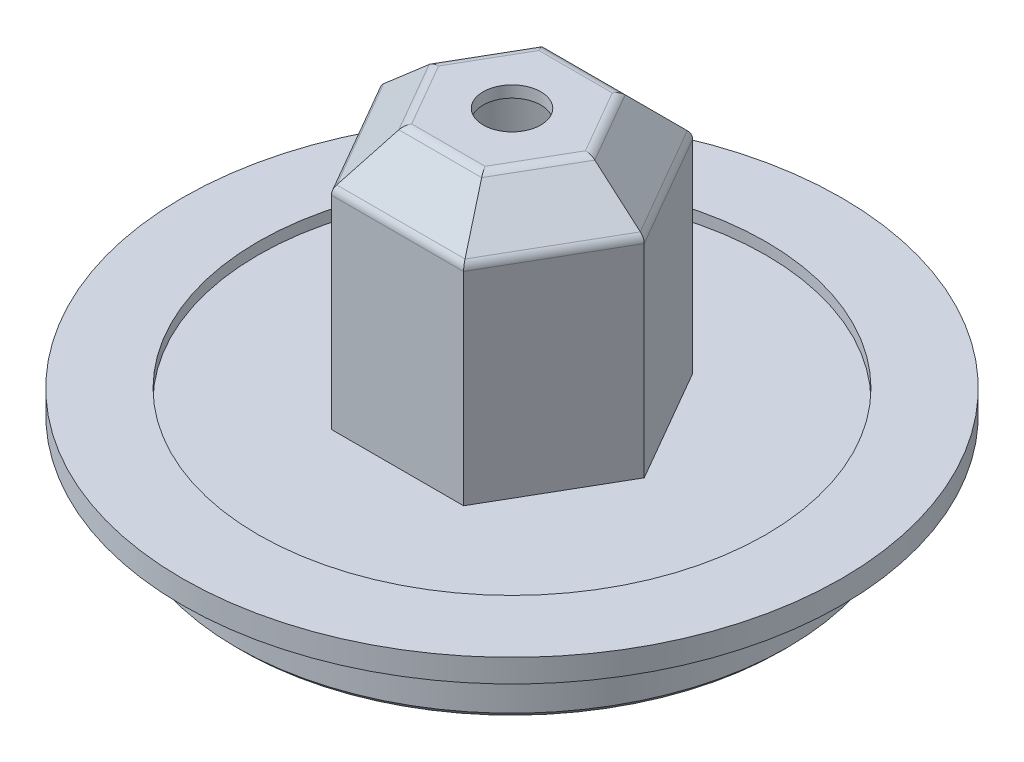
ISO-10303-21;
HEADER;
FILE_DESCRIPTION(('STEP AP214'),'2;1');
FILE_NAME('part.step','',(''),(''),'','','');
FILE_SCHEMA(('AUTOMOTIVE_DESIGN { 1 0 10303 214 1 1 1 1 }'));
ENDSEC;
DATA;
#1=APPLICATION_CONTEXT('core data for automotive mechanical design processes');
#2=APPLICATION_PROTOCOL_DEFINITION('international standard','automotive_design',2000,#1);
#3=PRODUCT_CONTEXT('',#1,'mechanical');
#4=PRODUCT('Part','Part','',(#3));
#5=PRODUCT_RELATED_PRODUCT_CATEGORY('part','',(#4));
#6=PRODUCT_DEFINITION_FORMATION('','',#4);
#7=PRODUCT_DEFINITION_CONTEXT('part definition',#1,'design');
#8=PRODUCT_DEFINITION('design','',#6,#7);
#9=PRODUCT_DEFINITION_SHAPE('','',#8);
#10=(LENGTH_UNIT() NAMED_UNIT(*) SI_UNIT(.MILLI.,.METRE.));
#11=(NAMED_UNIT(*) PLANE_ANGLE_UNIT() SI_UNIT($,.RADIAN.));
#12=(NAMED_UNIT(*) SI_UNIT($,.STERADIAN.) SOLID_ANGLE_UNIT());
#13=UNCERTAINTY_MEASURE_WITH_UNIT(LENGTH_MEASURE(1.E-05),#10,'distance_accuracy_value','');
#14=(GEOMETRIC_REPRESENTATION_CONTEXT(3) GLOBAL_UNCERTAINTY_ASSIGNED_CONTEXT((#13)) GLOBAL_UNIT_ASSIGNED_CONTEXT((#10,
#11,#12)) REPRESENTATION_CONTEXT('',''));
#15=CARTESIAN_POINT('',(0.,0.,0.));
#16=DIRECTION('',(0.,0.,1.));
#17=DIRECTION('',(1.,0.,0.));
#18=AXIS2_PLACEMENT_3D('',#15,#16,#17);
#19=CARTESIAN_POINT('',(0.,0.25,0.));
#20=DIRECTION('',(0.,-1.,0.));
#21=DIRECTION('',(-1.,0.,0.));
#22=AXIS2_PLACEMENT_3D('',#19,#20,#21);
#23=CONICAL_SURFACE('',#22,7.75,0.785398163397449);
#24=CARTESIAN_POINT('',(0.,0.,0.));
#25=DIRECTION('',(0.,-1.,0.));
#26=DIRECTION('',(-1.,0.,0.));
#27=AXIS2_PLACEMENT_3D('',#24,#25,#26);
#28=CIRCLE('',#27,8.);
#29=CARTESIAN_POINT('',(8.,0.,0.));
#30=VERTEX_POINT('',#29);
#31=EDGE_CURVE('E11',#30,#30,#28,.T.);
#32=ORIENTED_EDGE('',*,*,#31,.T.);
#33=DIRECTION('',(-0.707106781186548,0.707106781186547,0.));
#34=VECTOR('',#33,1.);
#35=CARTESIAN_POINT('',(7.75,0.25,0.));
#36=LINE('',#35,#34);
#37=CARTESIAN_POINT('',(7.5,0.5,0.));
#38=VERTEX_POINT('',#37);
#39=EDGE_CURVE('E28',#30,#38,#36,.T.);
#40=ORIENTED_EDGE('',*,*,#39,.T.);
#41=CARTESIAN_POINT('',(0.,0.5,0.));
#42=DIRECTION('',(0.,1.,0.));
#43=DIRECTION('',(-1.,0.,0.));
#44=AXIS2_PLACEMENT_3D('',#41,#42,#43);
#45=CIRCLE('',#44,7.5);
#46=CARTESIAN_POINT('',(-7.5,0.5,0.));
#47=VERTEX_POINT('',#46);
#48=EDGE_CURVE('E288',#38,#47,#45,.T.);
#49=ORIENTED_EDGE('',*,*,#48,.T.);
#50=CARTESIAN_POINT('',(0.,0.5,0.));
#51=DIRECTION('',(0.,1.,0.));
#52=DIRECTION('',(-1.,0.,0.));
#53=AXIS2_PLACEMENT_3D('',#50,#51,#52);
#54=CIRCLE('',#53,7.5);
#55=EDGE_CURVE('E358',#47,#38,#54,.T.);
#56=ORIENTED_EDGE('',*,*,#55,.T.);
#57=ORIENTED_EDGE('',*,*,#39,.F.);
#58=EDGE_LOOP('',(#32,#40,#49,#56,#57));
#59=FACE_BOUND('',#58,.T.);
#60=ADVANCED_FACE('F17',(#59),#23,.F.);
#61=CARTESIAN_POINT('',(0.,0.,0.));
#62=DIRECTION('',(0.,1.,0.));
#63=DIRECTION('',(1.,0.,0.));
#64=AXIS2_PLACEMENT_3D('',#61,#62,#63);
#65=PLANE('',#64);
#66=CARTESIAN_POINT('',(0.,0.,0.));
#67=DIRECTION('',(0.,1.,0.));
#68=DIRECTION('',(1.,0.,0.));
#69=AXIS2_PLACEMENT_3D('',#66,#67,#68);
#70=CIRCLE('',#69,23.4);
#71=CARTESIAN_POINT('',(-23.4,0.,0.));
#72=VERTEX_POINT('',#71);
#73=EDGE_CURVE('E299',#72,#72,#70,.T.);
#74=ORIENTED_EDGE('',*,*,#73,.F.);
#75=EDGE_LOOP('',(#74));
#76=FACE_BOUND('',#75,.T.);
#77=ORIENTED_EDGE('',*,*,#31,.F.);
#78=EDGE_LOOP('',(#77));
#79=FACE_BOUND('',#78,.T.);
#80=ADVANCED_FACE('F739',(#76,#79),#65,.F.);
#81=CARTESIAN_POINT('',(0.,0.,0.));
#82=DIRECTION('',(0.,1.,0.));
#83=DIRECTION('',(1.,0.,0.));
#84=AXIS2_PLACEMENT_3D('',#81,#82,#83);
#85=CYLINDRICAL_SURFACE('',#84,7.5);
#86=ORIENTED_EDGE('',*,*,#48,.F.);
#87=ORIENTED_EDGE('',*,*,#55,.F.);
#88=DIRECTION('',(0.,1.,0.));
#89=VECTOR('',#88,1.);
#90=CARTESIAN_POINT('',(-7.5,0.,0.));
#91=LINE('',#90,#89);
#92=CARTESIAN_POINT('',(-7.5,4.,0.));
#93=VERTEX_POINT('',#92);
#94=EDGE_CURVE('E362',#47,#93,#91,.T.);
#95=ORIENTED_EDGE('',*,*,#94,.T.);
#96=CARTESIAN_POINT('',(0.,4.,0.));
#97=DIRECTION('',(0.,1.,0.));
#98=DIRECTION('',(1.,0.,0.));
#99=AXIS2_PLACEMENT_3D('',#96,#97,#98);
#100=CIRCLE('',#99,7.5);
#101=CARTESIAN_POINT('',(7.5,4.,0.));
#102=VERTEX_POINT('',#101);
#103=EDGE_CURVE('E443',#93,#102,#100,.T.);
#104=ORIENTED_EDGE('',*,*,#103,.T.);
#105=CARTESIAN_POINT('',(0.,4.,0.));
#106=DIRECTION('',(0.,1.,0.));
#107=DIRECTION('',(1.,0.,0.));
#108=AXIS2_PLACEMENT_3D('',#105,#106,#107);
#109=CIRCLE('',#108,7.5);
#110=EDGE_CURVE('E384',#102,#93,#109,.T.);
#111=ORIENTED_EDGE('',*,*,#110,.T.);
#112=ORIENTED_EDGE('',*,*,#94,.F.);
#113=EDGE_LOOP('',(#86,#87,#95,#104,#111,#112));
#114=FACE_BOUND('',#113,.T.);
#115=ADVANCED_FACE('F745',(#114),#85,.F.);
#116=CARTESIAN_POINT('',(0.,0.25,0.));
#117=DIRECTION('',(0.,1.,0.));
#118=DIRECTION('',(1.,0.,0.));
#119=AXIS2_PLACEMENT_3D('',#116,#117,#118);
#120=CONICAL_SURFACE('',#119,23.65,0.785398163397447);
#121=CARTESIAN_POINT('',(0.,0.5,0.));
#122=DIRECTION('',(0.,-1.,0.));
#123=DIRECTION('',(1.,0.,0.));
#124=AXIS2_PLACEMENT_3D('',#121,#122,#123);
#125=CIRCLE('',#124,23.9);
#126=CARTESIAN_POINT('',(-23.9,0.5,0.));
#127=VERTEX_POINT('',#126);
#128=CARTESIAN_POINT('',(23.9,0.5,0.));
#129=VERTEX_POINT('',#128);
#130=EDGE_CURVE('E380',#127,#129,#125,.T.);
#131=ORIENTED_EDGE('',*,*,#130,.T.);
#132=CARTESIAN_POINT('',(0.,0.5,0.));
#133=DIRECTION('',(0.,-1.,0.));
#134=DIRECTION('',(1.,0.,0.));
#135=AXIS2_PLACEMENT_3D('',#132,#133,#134);
#136=CIRCLE('',#135,23.9);
#137=EDGE_CURVE('E385',#129,#127,#136,.T.);
#138=ORIENTED_EDGE('',*,*,#137,.T.);
#139=DIRECTION('',(0.707106781186546,-0.707106781186549,0.));
#140=VECTOR('',#139,1.);
#141=CARTESIAN_POINT('',(-23.65,0.25,0.));
#142=LINE('',#141,#140);
#143=EDGE_CURVE('E519',#127,#72,#142,.T.);
#144=ORIENTED_EDGE('',*,*,#143,.T.);
#145=ORIENTED_EDGE('',*,*,#73,.T.);
#146=ORIENTED_EDGE('',*,*,#143,.F.);
#147=EDGE_LOOP('',(#131,#138,#144,#145,#146));
#148=FACE_BOUND('',#147,.T.);
#149=ADVANCED_FACE('F752',(#148),#120,.T.);
#150=CARTESIAN_POINT('',(0.,0.,0.));
#151=DIRECTION('',(0.,1.,0.));
#152=DIRECTION('',(-1.,0.,0.));
#153=AXIS2_PLACEMENT_3D('',#150,#151,#152);
#154=CYLINDRICAL_SURFACE('',#153,23.9);
#155=CARTESIAN_POINT('',(0.,6.,0.));
#156=DIRECTION('',(0.,1.,0.));
#157=DIRECTION('',(-1.,0.,0.));
#158=AXIS2_PLACEMENT_3D('',#155,#156,#157);
#159=CIRCLE('',#158,23.9);
#160=CARTESIAN_POINT('',(-23.9,6.,0.));
#161=VERTEX_POINT('',#160);
#162=CARTESIAN_POINT('',(23.9,6.,0.));
#163=VERTEX_POINT('',#162);
#164=EDGE_CURVE('E294',#161,#163,#159,.T.);
#165=ORIENTED_EDGE('',*,*,#164,.F.);
#166=CARTESIAN_POINT('',(0.,6.,0.));
#167=DIRECTION('',(0.,1.,0.));
#168=DIRECTION('',(-1.,0.,0.));
#169=AXIS2_PLACEMENT_3D('',#166,#167,#168);
#170=CIRCLE('',#169,23.9);
#171=EDGE_CURVE('E279',#163,#161,#170,.T.);
#172=ORIENTED_EDGE('',*,*,#171,.F.);
#173=DIRECTION('',(0.,-1.,0.));
#174=VECTOR('',#173,1.);
#175=CARTESIAN_POINT('',(23.9,0.,0.));
#176=LINE('',#175,#174);
#177=EDGE_CURVE('E295',#163,#129,#176,.T.);
#178=ORIENTED_EDGE('',*,*,#177,.T.);
#179=ORIENTED_EDGE('',*,*,#130,.F.);
#180=ORIENTED_EDGE('',*,*,#137,.F.);
#181=ORIENTED_EDGE('',*,*,#177,.F.);
#182=EDGE_LOOP('',(#165,#172,#178,#179,#180,#181));
#183=FACE_BOUND('',#182,.T.);
#184=ADVANCED_FACE('F530',(#183),#154,.T.);
#185=CARTESIAN_POINT('',(1.43255035542676,28.,-5.51078643762691));
#186=DIRECTION('',(1.,0.,0.));
#187=DIRECTION('',(0.,0.923879532511287,-0.382683432365089));
#188=AXIS2_PLACEMENT_3D('',#185,#186,#187);
#189=CYLINDRICAL_SURFACE('',#188,1.);
#190=DIRECTION('',(1.,0.,0.));
#191=VECTOR('',#190,1.);
#192=CARTESIAN_POINT('',(1.43255035542676,29.,-5.51078643762691));
#193=LINE('',#192,#191);
#194=CARTESIAN_POINT('',(-3.18165403321043,29.,-5.51078643762691));
#195=VERTEX_POINT('',#194);
#196=CARTESIAN_POINT('',(3.18165403321042,29.,-5.51078643762691));
#197=VERTEX_POINT('',#196);
#198=EDGE_CURVE('E300',#195,#197,#193,.T.);
#199=ORIENTED_EDGE('',*,*,#198,.T.);
#200=CARTESIAN_POINT('',(3.18165403321042,28.,-5.51078643762691));
#201=DIRECTION('',(-0.866025403784439,0.,-0.5));
#202=DIRECTION('',(-0.5,0.,0.866025403784439));
#203=AXIS2_PLACEMENT_3D('',#200,#201,#202);
#204=ELLIPSE('',#203,1.15470053837925,1.);
#205=CARTESIAN_POINT('',(3.58990232367429,28.7071067811866,-6.21789321881346));
#206=VERTEX_POINT('',#205);
#207=EDGE_CURVE('E368',#197,#206,#204,.T.);
#208=ORIENTED_EDGE('',*,*,#207,.T.);
#209=DIRECTION('',(-1.,0.,0.));
#210=VECTOR('',#209,1.);
#211=CARTESIAN_POINT('',(1.43255035542675,28.7071067811866,-6.21789321881346));
#212=LINE('',#211,#210);
#213=CARTESIAN_POINT('',(-3.5899023236743,28.7071067811866,-6.21789321881345));
#214=VERTEX_POINT('',#213);
#215=EDGE_CURVE('E372',#206,#214,#212,.T.);
#216=ORIENTED_EDGE('',*,*,#215,.T.);
#217=CARTESIAN_POINT('',(-3.18165403321043,28.,-5.51078643762691));
#218=DIRECTION('',(0.866025403784437,0.,-0.5));
#219=DIRECTION('',(-0.5,0.,-0.866025403784437));
#220=AXIS2_PLACEMENT_3D('',#217,#218,#219);
#221=ELLIPSE('',#220,1.15470053837925,1.);
#222=EDGE_CURVE('E389',#214,#195,#221,.T.);
#223=ORIENTED_EDGE('',*,*,#222,.T.);
#224=EDGE_LOOP('',(#199,#208,#216,#223));
#225=FACE_BOUND('',#224,.T.);
#226=ADVANCED_FACE('F694',(#225),#189,.T.);
#227=CARTESIAN_POINT('',(5.48875622752902,28.,-1.51476821881346));
#228=DIRECTION('',(0.5,0.,0.866025403784438));
#229=DIRECTION('',(0.331413574035592,0.923879532511287,-0.191341716182545));
#230=AXIS2_PLACEMENT_3D('',#227,#228,#229);
#231=CYLINDRICAL_SURFACE('',#230,1.);
#232=DIRECTION('',(0.5,0.,0.866025403784438));
#233=VECTOR('',#232,1.);
#234=CARTESIAN_POINT('',(5.48875622752902,29.,-1.51476821881346));
#235=LINE('',#234,#233);
#236=CARTESIAN_POINT('',(6.36330806642086,29.,0.));
#237=VERTEX_POINT('',#236);
#238=EDGE_CURVE('E21',#197,#237,#235,.T.);
#239=ORIENTED_EDGE('',*,*,#238,.T.);
#240=CARTESIAN_POINT('',(6.36330806642086,28.,0.));
#241=DIRECTION('',(0.,0.,-1.));
#242=DIRECTION('',(-1.,0.,0.));
#243=AXIS2_PLACEMENT_3D('',#240,#241,#242);
#244=ELLIPSE('',#243,1.15470053837925,1.);
#245=CARTESIAN_POINT('',(7.17980464734859,28.7071067811865,0.));
#246=VERTEX_POINT('',#245);
#247=EDGE_CURVE('E260',#237,#246,#244,.T.);
#248=ORIENTED_EDGE('',*,*,#247,.T.);
#249=DIRECTION('',(-0.5,0.,-0.866025403784438));
#250=VECTOR('',#249,1.);
#251=CARTESIAN_POINT('',(6.10112866322482,28.7071067811865,-1.86832160940673));
#252=LINE('',#251,#250);
#253=EDGE_CURVE('E264',#246,#206,#252,.T.);
#254=ORIENTED_EDGE('',*,*,#253,.T.);
#255=ORIENTED_EDGE('',*,*,#207,.F.);
#256=EDGE_LOOP('',(#239,#248,#254,#255));
#257=FACE_BOUND('',#256,.T.);
#258=ADVANCED_FACE('F583',(#257),#231,.T.);
#259=CARTESIAN_POINT('',(4.05620587210227,28.,3.99601821881344));
#260=DIRECTION('',(-0.5,0.,0.866025403784439));
#261=DIRECTION('',(0.331413574035592,0.923879532511287,0.191341716182545));
#262=AXIS2_PLACEMENT_3D('',#259,#260,#261);
#263=CYLINDRICAL_SURFACE('',#262,1.);
#264=DIRECTION('',(0.5,0.,-0.866025403784439));
#265=VECTOR('',#264,1.);
#266=CARTESIAN_POINT('',(4.66857830779806,28.7071067811866,4.34957160940672));
#267=LINE('',#266,#265);
#268=CARTESIAN_POINT('',(3.58990232367429,28.7071067811866,6.21789321881344));
#269=VERTEX_POINT('',#268);
#270=EDGE_CURVE('E248',#269,#246,#267,.T.);
#271=ORIENTED_EDGE('',*,*,#270,.T.);
#272=ORIENTED_EDGE('',*,*,#247,.F.);
#273=DIRECTION('',(-0.5,0.,0.866025403784439));
#274=VECTOR('',#273,1.);
#275=CARTESIAN_POINT('',(4.05620587210227,29.,3.99601821881344));
#276=LINE('',#275,#274);
#277=CARTESIAN_POINT('',(3.18165403321043,29.,5.51078643762689));
#278=VERTEX_POINT('',#277);
#279=EDGE_CURVE('E244',#237,#278,#276,.T.);
#280=ORIENTED_EDGE('',*,*,#279,.T.);
#281=CARTESIAN_POINT('',(3.18165403321043,28.,5.51078643762689));
#282=DIRECTION('',(0.866025403784439,0.,-0.5));
#283=DIRECTION('',(-0.5,0.,-0.866025403784439));
#284=AXIS2_PLACEMENT_3D('',#281,#282,#283);
#285=ELLIPSE('',#284,1.15470053837925,1.);
#286=EDGE_CURVE('E249',#278,#269,#285,.T.);
#287=ORIENTED_EDGE('',*,*,#286,.T.);
#288=EDGE_LOOP('',(#271,#272,#280,#287));
#289=FACE_BOUND('',#288,.T.);
#290=ADVANCED_FACE('F549',(#289),#263,.T.);
#291=CARTESIAN_POINT('',(-1.43255035542675,28.,5.51078643762689));
#292=DIRECTION('',(-1.,0.,0.));
#293=DIRECTION('',(0.,0.923879532511287,0.382683432365089));
#294=AXIS2_PLACEMENT_3D('',#291,#292,#293);
#295=CYLINDRICAL_SURFACE('',#294,1.);
#296=DIRECTION('',(1.,0.,0.));
#297=VECTOR('',#296,1.);
#298=CARTESIAN_POINT('',(-1.43255035542675,28.7071067811866,6.21789321881344));
#299=LINE('',#298,#297);
#300=CARTESIAN_POINT('',(-3.58990232367429,28.7071067811866,6.21789321881344));
#301=VERTEX_POINT('',#300);
#302=EDGE_CURVE('E301',#301,#269,#299,.T.);
#303=ORIENTED_EDGE('',*,*,#302,.T.);
#304=ORIENTED_EDGE('',*,*,#286,.F.);
#305=DIRECTION('',(-1.,0.,0.));
#306=VECTOR('',#305,1.);
#307=CARTESIAN_POINT('',(-1.43255035542675,29.,5.51078643762689));
#308=LINE('',#307,#306);
#309=CARTESIAN_POINT('',(-3.18165403321043,29.,5.51078643762689));
#310=VERTEX_POINT('',#309);
#311=EDGE_CURVE('E269',#278,#310,#308,.T.);
#312=ORIENTED_EDGE('',*,*,#311,.T.);
#313=CARTESIAN_POINT('',(-3.18165403321043,28.,5.51078643762689));
#314=DIRECTION('',(0.86602540378444,0.,0.5));
#315=DIRECTION('',(0.5,0.,-0.86602540378444));
#316=AXIS2_PLACEMENT_3D('',#313,#314,#315);
#317=ELLIPSE('',#316,1.15470053837925,1.);
#318=EDGE_CURVE('E265',#310,#301,#317,.T.);
#319=ORIENTED_EDGE('',*,*,#318,.T.);
#320=EDGE_LOOP('',(#303,#304,#312,#319));
#321=FACE_BOUND('',#320,.T.);
#322=ADVANCED_FACE('F543',(#321),#295,.T.);
#323=CARTESIAN_POINT('',(-5.48875622752902,28.,1.51476821881345));
#324=DIRECTION('',(-0.5,0.,-0.866025403784439));
#325=DIRECTION('',(-0.331413574035592,0.923879532511287,0.191341716182545));
#326=AXIS2_PLACEMENT_3D('',#323,#324,#325);
#327=CYLINDRICAL_SURFACE('',#326,1.);
#328=DIRECTION('',(0.5,0.,0.866025403784439));
#329=VECTOR('',#328,1.);
#330=CARTESIAN_POINT('',(-6.10112866322482,28.7071067811866,1.86832160940672));
#331=LINE('',#330,#329);
#332=CARTESIAN_POINT('',(-7.17980464734859,28.7071067811866,0.));
#333=VERTEX_POINT('',#332);
#334=EDGE_CURVE('E270',#333,#301,#331,.T.);
#335=ORIENTED_EDGE('',*,*,#334,.T.);
#336=ORIENTED_EDGE('',*,*,#318,.F.);
#337=DIRECTION('',(-0.5,0.,-0.866025403784439));
#338=VECTOR('',#337,1.);
#339=CARTESIAN_POINT('',(-5.48875622752902,29.,1.51476821881345));
#340=LINE('',#339,#338);
#341=CARTESIAN_POINT('',(-6.36330806642086,29.,0.));
#342=VERTEX_POINT('',#341);
#343=EDGE_CURVE('E406',#310,#342,#340,.T.);
#344=ORIENTED_EDGE('',*,*,#343,.T.);
#345=CARTESIAN_POINT('',(-6.36330806642086,28.,0.));
#346=DIRECTION('',(0.,0.,1.));
#347=DIRECTION('',(1.,0.,0.));
#348=AXIS2_PLACEMENT_3D('',#345,#346,#347);
#349=ELLIPSE('',#348,1.15470053837925,1.);
#350=EDGE_CURVE('E402',#342,#333,#349,.T.);
#351=ORIENTED_EDGE('',*,*,#350,.T.);
#352=EDGE_LOOP('',(#335,#336,#344,#351));
#353=FACE_BOUND('',#352,.T.);
#354=ADVANCED_FACE('F641',(#353),#327,.T.);
#355=CARTESIAN_POINT('',(-4.05620587210227,28.,-3.99601821881346));
#356=DIRECTION('',(0.5,0.,-0.866025403784439));
#357=DIRECTION('',(-0.331413574035591,0.923879532511287,-0.191341716182544));
#358=AXIS2_PLACEMENT_3D('',#355,#356,#357);
#359=CYLINDRICAL_SURFACE('',#358,1.);
#360=DIRECTION('',(-0.5,0.,0.866025403784439));
#361=VECTOR('',#360,1.);
#362=CARTESIAN_POINT('',(-4.66857830779806,28.7071067811866,-4.34957160940673));
#363=LINE('',#362,#361);
#364=EDGE_CURVE('E407',#214,#333,#363,.T.);
#365=ORIENTED_EDGE('',*,*,#364,.T.);
#366=ORIENTED_EDGE('',*,*,#350,.F.);
#367=DIRECTION('',(0.5,0.,-0.866025403784439));
#368=VECTOR('',#367,1.);
#369=CARTESIAN_POINT('',(-4.05620587210227,29.,-3.99601821881346));
#370=LINE('',#369,#368);
#371=EDGE_CURVE('E343',#342,#195,#370,.T.);
#372=ORIENTED_EDGE('',*,*,#371,.T.);
#373=ORIENTED_EDGE('',*,*,#222,.F.);
#374=EDGE_LOOP('',(#365,#366,#372,#373));
#375=FACE_BOUND('',#374,.T.);
#376=ADVANCED_FACE('F644',(#375),#359,.T.);
#377=CARTESIAN_POINT('',(-8.29580168041843,27.,1.48125));
#378=DIRECTION('',(-0.612372435695794,0.707106781186548,0.353553390593274));
#379=DIRECTION('',(0.5,0.,0.866025403784438));
#380=AXIS2_PLACEMENT_3D('',#377,#378,#379);
#381=PLANE('',#380);
#382=ORIENTED_EDGE('',*,*,#334,.F.);
#383=DIRECTION('',(-0.755928946018455,-0.654653670707977,0.));
#384=VECTOR('',#383,1.);
#385=CARTESIAN_POINT('',(-6.84160068989707,29.,0.));
#386=LINE('',#385,#384);
#387=CARTESIAN_POINT('',(-11.1221988859625,25.2928932188135,0.));
#388=VERTEX_POINT('',#387);
#389=EDGE_CURVE('E339',#333,#388,#386,.T.);
#390=ORIENTED_EDGE('',*,*,#389,.T.);
#391=DIRECTION('',(-0.5,0.,-0.866025403784439));
#392=VECTOR('',#391,1.);
#393=CARTESIAN_POINT('',(-10.490474697612,25.2928932188135,1.09417839059327));
#394=LINE('',#393,#392);
#395=CARTESIAN_POINT('',(-5.56109944298127,25.2928932188135,9.63210678118654));
#396=VERTEX_POINT('',#395);
#397=EDGE_CURVE('E240',#396,#388,#394,.T.);
#398=ORIENTED_EDGE('',*,*,#397,.F.);
#399=DIRECTION('',(-0.377964473009227,-0.654653670707977,0.654653670707977));
#400=VECTOR('',#399,1.);
#401=CARTESIAN_POINT('',(-3.42080034494853,29.,5.925));
#402=LINE('',#401,#400);
#403=EDGE_CURVE('E250',#301,#396,#402,.T.);
#404=ORIENTED_EDGE('',*,*,#403,.F.);
#405=EDGE_LOOP('',(#382,#390,#398,#404));
#406=FACE_BOUND('',#405,.T.);
#407=ADVANCED_FACE('F640',(#406),#381,.T.);
#408=CARTESIAN_POINT('',(-5.43070096956492,27.,-6.44375));
#409=DIRECTION('',(-0.612372435695795,0.707106781186548,-0.353553390593273));
#410=DIRECTION('',(-0.5,0.,0.866025403784439));
#411=AXIS2_PLACEMENT_3D('',#408,#409,#410);
#412=PLANE('',#411);
#413=ORIENTED_EDGE('',*,*,#364,.F.);
#414=DIRECTION('',(-0.377964473009228,-0.654653670707977,-0.654653670707977));
#415=VECTOR('',#414,1.);
#416=CARTESIAN_POINT('',(-3.42080034494854,29.,-5.925));
#417=LINE('',#416,#415);
#418=CARTESIAN_POINT('',(-5.56109944298128,25.2928932188135,-9.63210678118655));
#419=VERTEX_POINT('',#418);
#420=EDGE_CURVE('E319',#214,#419,#417,.T.);
#421=ORIENTED_EDGE('',*,*,#420,.T.);
#422=DIRECTION('',(0.5,0.,-0.866025403784439));
#423=VECTOR('',#422,1.);
#424=CARTESIAN_POINT('',(-6.19282363133178,25.2928932188135,-8.53792839059328));
#425=LINE('',#424,#423);
#426=EDGE_CURVE('E276',#388,#419,#425,.T.);
#427=ORIENTED_EDGE('',*,*,#426,.F.);
#428=ORIENTED_EDGE('',*,*,#389,.F.);
#429=EDGE_LOOP('',(#413,#421,#427,#428));
#430=FACE_BOUND('',#429,.T.);
#431=ADVANCED_FACE('F492',(#430),#412,.T.);
#432=CARTESIAN_POINT('',(2.86510071085351,27.,-7.925));
#433=DIRECTION('',(0.,0.707106781186548,-0.707106781186547));
#434=DIRECTION('',(-1.,0.,0.));
#435=AXIS2_PLACEMENT_3D('',#432,#433,#434);
#436=PLANE('',#435);
#437=ORIENTED_EDGE('',*,*,#215,.F.);
#438=DIRECTION('',(0.377964473009227,-0.654653670707977,-0.654653670707978));
#439=VECTOR('',#438,1.);
#440=CARTESIAN_POINT('',(3.42080034494852,29.,-5.925));
#441=LINE('',#440,#439);
#442=CARTESIAN_POINT('',(5.56109944298126,25.2928932188135,-9.63210678118656));
#443=VERTEX_POINT('',#442);
#444=EDGE_CURVE('E315',#206,#443,#441,.T.);
#445=ORIENTED_EDGE('',*,*,#444,.T.);
#446=DIRECTION('',(1.,0.,0.));
#447=VECTOR('',#446,1.);
#448=CARTESIAN_POINT('',(4.29765106628027,25.2928932188135,-9.63210678118656));
#449=LINE('',#448,#447);
#450=EDGE_CURVE('E483',#419,#443,#449,.T.);
#451=ORIENTED_EDGE('',*,*,#450,.F.);
#452=ORIENTED_EDGE('',*,*,#420,.F.);
#453=EDGE_LOOP('',(#437,#445,#451,#452));
#454=FACE_BOUND('',#453,.T.);
#455=ADVANCED_FACE('F485',(#454),#436,.T.);
#456=CARTESIAN_POINT('',(0.,29.,0.));
#457=DIRECTION('',(0.,1.,0.));
#458=DIRECTION('',(1.,0.,0.));
#459=AXIS2_PLACEMENT_3D('',#456,#457,#458);
#460=PLANE('',#459);
#461=ORIENTED_EDGE('',*,*,#198,.F.);
#462=ORIENTED_EDGE('',*,*,#371,.F.);
#463=ORIENTED_EDGE('',*,*,#343,.F.);
#464=ORIENTED_EDGE('',*,*,#311,.F.);
#465=ORIENTED_EDGE('',*,*,#279,.F.);
#466=ORIENTED_EDGE('',*,*,#238,.F.);
#467=EDGE_LOOP('',(#461,#462,#463,#464,#465,#466));
#468=FACE_BOUND('',#467,.T.);
#469=CARTESIAN_POINT('',(0.,29.,0.));
#470=DIRECTION('',(0.,-1.,0.));
#471=DIRECTION('',(1.,0.,0.));
#472=AXIS2_PLACEMENT_3D('',#469,#470,#471);
#473=CIRCLE('',#472,2.5);
#474=CARTESIAN_POINT('',(-2.5,29.,0.));
#475=VERTEX_POINT('',#474);
#476=EDGE_CURVE('E320',#475,#475,#473,.T.);
#477=ORIENTED_EDGE('',*,*,#476,.T.);
#478=EDGE_LOOP('',(#477));
#479=FACE_BOUND('',#478,.T.);
#480=ADVANCED_FACE('F588',(#468,#479),#460,.T.);
#481=CARTESIAN_POINT('',(4.29765106628027,24.5857864376269,-8.925));
#482=DIRECTION('',(-1.,0.,0.));
#483=DIRECTION('',(0.,0.382683432365089,-0.923879532511287));
#484=AXIS2_PLACEMENT_3D('',#481,#482,#483);
#485=CYLINDRICAL_SURFACE('',#484,1.);
#486=DIRECTION('',(-1.,0.,0.));
#487=VECTOR('',#486,1.);
#488=CARTESIAN_POINT('',(4.29765106628027,24.5857864376269,-9.925));
#489=LINE('',#488,#487);
#490=CARTESIAN_POINT('',(5.73020142170702,24.5857864376269,-9.925));
#491=VERTEX_POINT('',#490);
#492=CARTESIAN_POINT('',(-5.73020142170704,24.5857864376269,-9.925));
#493=VERTEX_POINT('',#492);
#494=EDGE_CURVE('E393',#491,#493,#489,.T.);
#495=ORIENTED_EDGE('',*,*,#494,.T.);
#496=CARTESIAN_POINT('',(-5.15285115251742,24.5857864376269,-8.925));
#497=DIRECTION('',(0.866025403784439,0.,-0.5));
#498=DIRECTION('',(0.5,0.,0.866025403784439));
#499=AXIS2_PLACEMENT_3D('',#496,#497,#498);
#500=ELLIPSE('',#499,1.15470053837925,1.);
#501=EDGE_CURVE('E397',#493,#419,#500,.T.);
#502=ORIENTED_EDGE('',*,*,#501,.T.);
#503=ORIENTED_EDGE('',*,*,#450,.T.);
#504=CARTESIAN_POINT('',(5.1528511525174,24.5857864376269,-8.925));
#505=DIRECTION('',(-0.866025403784439,0.,-0.5));
#506=DIRECTION('',(0.5,0.,-0.866025403784439));
#507=AXIS2_PLACEMENT_3D('',#504,#505,#506);
#508=ELLIPSE('',#507,1.15470053837925,1.);
#509=EDGE_CURVE('E238',#443,#491,#508,.T.);
#510=ORIENTED_EDGE('',*,*,#509,.T.);
#511=EDGE_LOOP('',(#495,#502,#503,#510));
#512=FACE_BOUND('',#511,.T.);
#513=ADVANCED_FACE('F496',(#512),#485,.T.);
#514=CARTESIAN_POINT('',(9.87810226191625,24.5857864376269,-0.740625000000009));
#515=DIRECTION('',(-0.5,0.,-0.866025403784439));
#516=DIRECTION('',(0.800103145191266,0.382683432365089,-0.461939766255644));
#517=AXIS2_PLACEMENT_3D('',#514,#515,#516);
#518=CYLINDRICAL_SURFACE('',#517,1.);
#519=DIRECTION('',(-0.5,0.,-0.866025403784438));
#520=VECTOR('',#519,1.);
#521=CARTESIAN_POINT('',(10.7441276657007,24.5857864376269,-1.240625));
#522=LINE('',#521,#520);
#523=CARTESIAN_POINT('',(11.4604028434141,24.5857864376269,0.));
#524=VERTEX_POINT('',#523);
#525=EDGE_CURVE('E357',#524,#491,#522,.T.);
#526=ORIENTED_EDGE('',*,*,#525,.T.);
#527=ORIENTED_EDGE('',*,*,#509,.F.);
#528=DIRECTION('',(0.5,0.,0.866025403784438));
#529=VECTOR('',#528,1.);
#530=CARTESIAN_POINT('',(10.490474697612,25.2928932188135,-1.09417839059328));
#531=LINE('',#530,#529);
#532=CARTESIAN_POINT('',(11.1221988859625,25.2928932188135,0.));
#533=VERTEX_POINT('',#532);
#534=EDGE_CURVE('E309',#443,#533,#531,.T.);
#535=ORIENTED_EDGE('',*,*,#534,.T.);
#536=CARTESIAN_POINT('',(10.3057023050348,24.5857864376269,0.));
#537=DIRECTION('',(0.,0.,-1.));
#538=DIRECTION('',(1.,0.,0.));
#539=AXIS2_PLACEMENT_3D('',#536,#537,#538);
#540=ELLIPSE('',#539,1.15470053837925,1.);
#541=EDGE_CURVE('E305',#533,#524,#540,.T.);
#542=ORIENTED_EDGE('',*,*,#541,.T.);
#543=EDGE_LOOP('',(#526,#527,#535,#542));
#544=FACE_BOUND('',#543,.T.);
#545=ADVANCED_FACE('F577',(#544),#518,.T.);
#546=CARTESIAN_POINT('',(5.58045119563598,24.5857864376269,8.184375));
#547=DIRECTION('',(0.5,0.,-0.866025403784439));
#548=DIRECTION('',(0.800103145191266,0.382683432365089,0.461939766255644));
#549=AXIS2_PLACEMENT_3D('',#546,#547,#548);
#550=CYLINDRICAL_SURFACE('',#549,1.);
#551=DIRECTION('',(0.5,0.,-0.866025403784439));
#552=VECTOR('',#551,1.);
#553=CARTESIAN_POINT('',(6.44647659942042,24.5857864376269,8.684375));
#554=LINE('',#553,#552);
#555=CARTESIAN_POINT('',(5.73020142170704,24.5857864376269,9.925));
#556=VERTEX_POINT('',#555);
#557=EDGE_CURVE('E310',#556,#524,#554,.T.);
#558=ORIENTED_EDGE('',*,*,#557,.T.);
#559=ORIENTED_EDGE('',*,*,#541,.F.);
#560=DIRECTION('',(-0.5,0.,0.866025403784439));
#561=VECTOR('',#560,1.);
#562=CARTESIAN_POINT('',(6.19282363133177,25.2928932188135,8.53792839059327));
#563=LINE('',#562,#561);
#564=CARTESIAN_POINT('',(5.56109944298127,25.2928932188135,9.63210678118654));
#565=VERTEX_POINT('',#564);
#566=EDGE_CURVE('E365',#533,#565,#563,.T.);
#567=ORIENTED_EDGE('',*,*,#566,.T.);
#568=CARTESIAN_POINT('',(5.15285115251741,24.5857864376269,8.925));
#569=DIRECTION('',(0.866025403784438,0.,-0.5));
#570=DIRECTION('',(0.5,0.,0.866025403784438));
#571=AXIS2_PLACEMENT_3D('',#568,#569,#570);
#572=ELLIPSE('',#571,1.15470053837925,1.);
#573=EDGE_CURVE('E401',#565,#556,#572,.T.);
#574=ORIENTED_EDGE('',*,*,#573,.T.);
#575=EDGE_LOOP('',(#558,#559,#567,#574));
#576=FACE_BOUND('',#575,.T.);
#577=ADVANCED_FACE('F573',(#576),#550,.T.);
#578=CARTESIAN_POINT('',(-4.29765106628027,24.5857864376269,8.925));
#579=DIRECTION('',(1.,0.,0.));
#580=DIRECTION('',(0.,0.382683432365089,0.923879532511287));
#581=AXIS2_PLACEMENT_3D('',#578,#579,#580);
#582=CYLINDRICAL_SURFACE('',#581,1.);
#583=DIRECTION('',(1.,0.,0.));
#584=VECTOR('',#583,1.);
#585=CARTESIAN_POINT('',(-4.29765106628027,24.5857864376269,9.925));
#586=LINE('',#585,#584);
#587=CARTESIAN_POINT('',(-5.73020142170703,24.5857864376269,9.925));
#588=VERTEX_POINT('',#587);
#589=EDGE_CURVE('E408',#588,#556,#586,.T.);
#590=ORIENTED_EDGE('',*,*,#589,.T.);
#591=ORIENTED_EDGE('',*,*,#573,.F.);
#592=DIRECTION('',(-1.,0.,0.));
#593=VECTOR('',#592,1.);
#594=CARTESIAN_POINT('',(-4.29765106628027,25.2928932188135,9.63210678118654));
#595=LINE('',#594,#593);
#596=EDGE_CURVE('E411',#565,#396,#595,.T.);
#597=ORIENTED_EDGE('',*,*,#596,.T.);
#598=CARTESIAN_POINT('',(-5.15285115251741,24.5857864376269,8.925));
#599=DIRECTION('',(-0.866025403784439,0.,-0.5));
#600=DIRECTION('',(0.5,0.,-0.866025403784439));
#601=AXIS2_PLACEMENT_3D('',#598,#599,#600);
#602=ELLIPSE('',#601,1.15470053837925,1.);
#603=EDGE_CURVE('E242',#588,#396,#602,.T.);
#604=ORIENTED_EDGE('',*,*,#603,.F.);
#605=EDGE_LOOP('',(#590,#591,#597,#604));
#606=FACE_BOUND('',#605,.T.);
#607=ADVANCED_FACE('F568',(#606),#582,.T.);
#608=CARTESIAN_POINT('',(-5.58045119563598,24.5857864376269,-8.184375));
#609=DIRECTION('',(-0.5,0.,0.866025403784439));
#610=DIRECTION('',(-0.800103145191266,0.382683432365089,-0.461939766255644));
#611=AXIS2_PLACEMENT_3D('',#608,#609,#610);
#612=CYLINDRICAL_SURFACE('',#611,1.);
#613=DIRECTION('',(-0.5,0.,0.866025403784439));
#614=VECTOR('',#613,1.);
#615=CARTESIAN_POINT('',(-6.44647659942042,24.5857864376269,-8.684375));
#616=LINE('',#615,#614);
#617=CARTESIAN_POINT('',(-11.4604028434141,24.5857864376269,0.));
#618=VERTEX_POINT('',#617);
#619=EDGE_CURVE('E275',#493,#618,#616,.T.);
#620=ORIENTED_EDGE('',*,*,#619,.T.);
#621=CARTESIAN_POINT('',(-10.3057023050348,24.5857864376269,0.));
#622=DIRECTION('',(0.,0.,-1.));
#623=DIRECTION('',(1.,0.,0.));
#624=AXIS2_PLACEMENT_3D('',#621,#622,#623);
#625=ELLIPSE('',#624,1.15470053837925,1.);
#626=EDGE_CURVE('E271',#618,#388,#625,.T.);
#627=ORIENTED_EDGE('',*,*,#626,.T.);
#628=ORIENTED_EDGE('',*,*,#426,.T.);
#629=ORIENTED_EDGE('',*,*,#501,.F.);
#630=EDGE_LOOP('',(#620,#627,#628,#629));
#631=FACE_BOUND('',#630,.T.);
#632=ADVANCED_FACE('F474',(#631),#612,.T.);
#633=CARTESIAN_POINT('',(-9.87810226191625,24.5857864376269,0.740625));
#634=DIRECTION('',(0.5,0.,0.866025403784439));
#635=DIRECTION('',(-0.800103145191266,0.382683432365089,0.461939766255644));
#636=AXIS2_PLACEMENT_3D('',#633,#634,#635);
#637=CYLINDRICAL_SURFACE('',#636,1.);
#638=DIRECTION('',(0.5,0.,0.866025403784439));
#639=VECTOR('',#638,1.);
#640=CARTESIAN_POINT('',(-10.7441276657007,24.5857864376269,1.240625));
#641=LINE('',#640,#639);
#642=EDGE_CURVE('E425',#618,#588,#641,.T.);
#643=ORIENTED_EDGE('',*,*,#642,.T.);
#644=ORIENTED_EDGE('',*,*,#603,.T.);
#645=ORIENTED_EDGE('',*,*,#397,.T.);
#646=ORIENTED_EDGE('',*,*,#626,.F.);
#647=EDGE_LOOP('',(#643,#644,#645,#646));
#648=FACE_BOUND('',#647,.T.);
#649=ADVANCED_FACE('F637',(#648),#637,.T.);
#650=CARTESIAN_POINT('',(5.43070096956492,27.,6.44375));
#651=DIRECTION('',(0.612372435695794,0.707106781186548,0.353553390593274));
#652=DIRECTION('',(0.5,0.,-0.866025403784438));
#653=AXIS2_PLACEMENT_3D('',#650,#651,#652);
#654=PLANE('',#653);
#655=ORIENTED_EDGE('',*,*,#270,.F.);
#656=DIRECTION('',(0.377964473009227,-0.654653670707977,0.654653670707977));
#657=VECTOR('',#656,1.);
#658=CARTESIAN_POINT('',(3.42080034494853,29.,5.925));
#659=LINE('',#658,#657);
#660=EDGE_CURVE('E243',#269,#565,#659,.T.);
#661=ORIENTED_EDGE('',*,*,#660,.T.);
#662=ORIENTED_EDGE('',*,*,#566,.F.);
#663=DIRECTION('',(0.755928946018455,-0.654653670707977,0.));
#664=VECTOR('',#663,1.);
#665=CARTESIAN_POINT('',(6.84160068989707,29.,0.));
#666=LINE('',#665,#664);
#667=EDGE_CURVE('E314',#246,#533,#666,.T.);
#668=ORIENTED_EDGE('',*,*,#667,.F.);
#669=EDGE_LOOP('',(#655,#661,#662,#668));
#670=FACE_BOUND('',#669,.T.);
#671=ADVANCED_FACE('F555',(#670),#654,.T.);
#672=CARTESIAN_POINT('',(8.29580168041843,27.,-1.48125));
#673=DIRECTION('',(0.612372435695794,0.707106781186548,-0.353553390593274));
#674=DIRECTION('',(-0.5,0.,-0.866025403784438));
#675=AXIS2_PLACEMENT_3D('',#672,#673,#674);
#676=PLANE('',#675);
#677=ORIENTED_EDGE('',*,*,#253,.F.);
#678=ORIENTED_EDGE('',*,*,#667,.T.);
#679=ORIENTED_EDGE('',*,*,#534,.F.);
#680=ORIENTED_EDGE('',*,*,#444,.F.);
#681=EDGE_LOOP('',(#677,#678,#679,#680));
#682=FACE_BOUND('',#681,.T.);
#683=ADVANCED_FACE('F579',(#682),#676,.T.);
#684=CARTESIAN_POINT('',(-11.4604028434141,7.,0.));
#685=DIRECTION('',(-0.866025403784439,0.,0.5));
#686=DIRECTION('',(0.,1.,0.));
#687=AXIS2_PLACEMENT_3D('',#684,#685,#686);
#688=PLANE('',#687);
#689=ORIENTED_EDGE('',*,*,#642,.F.);
#690=DIRECTION('',(0.,1.,0.));
#691=VECTOR('',#690,1.);
#692=CARTESIAN_POINT('',(-11.4604028434141,7.,0.));
#693=LINE('',#692,#691);
#694=CARTESIAN_POINT('',(-11.4604028434141,7.,0.));
#695=VERTEX_POINT('',#694);
#696=EDGE_CURVE('E420',#695,#618,#693,.T.);
#697=ORIENTED_EDGE('',*,*,#696,.F.);
#698=DIRECTION('',(-0.5,0.,-0.866025403784439));
#699=VECTOR('',#698,1.);
#700=CARTESIAN_POINT('',(-10.0278524879873,7.,2.48125));
#701=LINE('',#700,#699);
#702=CARTESIAN_POINT('',(-5.73020142170703,7.,9.925));
#703=VERTEX_POINT('',#702);
#704=EDGE_CURVE('E281',#703,#695,#701,.T.);
#705=ORIENTED_EDGE('',*,*,#704,.F.);
#706=DIRECTION('',(0.,1.,0.));
#707=VECTOR('',#706,1.);
#708=CARTESIAN_POINT('',(-5.73020142170703,7.,9.925));
#709=LINE('',#708,#707);
#710=EDGE_CURVE('E324',#703,#588,#709,.T.);
#711=ORIENTED_EDGE('',*,*,#710,.T.);
#712=EDGE_LOOP('',(#689,#697,#705,#711));
#713=FACE_BOUND('',#712,.T.);
#714=ADVANCED_FACE('F634',(#713),#688,.T.);
#715=CARTESIAN_POINT('',(-5.73020142170704,7.,-9.925));
#716=DIRECTION('',(-0.866025403784439,0.,-0.5));
#717=DIRECTION('',(-0.5,0.,0.866025403784439));
#718=AXIS2_PLACEMENT_3D('',#715,#716,#717);
#719=PLANE('',#718);
#720=ORIENTED_EDGE('',*,*,#619,.F.);
#721=DIRECTION('',(0.,1.,0.));
#722=VECTOR('',#721,1.);
#723=CARTESIAN_POINT('',(-5.73020142170704,7.,-9.925));
#724=LINE('',#723,#722);
#725=CARTESIAN_POINT('',(-5.73020142170704,7.,-9.925));
#726=VERTEX_POINT('',#725);
#727=EDGE_CURVE('E424',#726,#493,#724,.T.);
#728=ORIENTED_EDGE('',*,*,#727,.F.);
#729=DIRECTION('',(0.5,0.,-0.866025403784439));
#730=VECTOR('',#729,1.);
#731=CARTESIAN_POINT('',(-7.1627517771338,7.,-7.44375));
#732=LINE('',#731,#730);
#733=EDGE_CURVE('E258',#695,#726,#732,.T.);
#734=ORIENTED_EDGE('',*,*,#733,.F.);
#735=ORIENTED_EDGE('',*,*,#696,.T.);
#736=EDGE_LOOP('',(#720,#728,#734,#735));
#737=FACE_BOUND('',#736,.T.);
#738=ADVANCED_FACE('F631',(#737),#719,.T.);
#739=CARTESIAN_POINT('',(5.73020142170702,7.,-9.925));
#740=DIRECTION('',(0.,0.,-1.));
#741=DIRECTION('',(-1.,0.,0.));
#742=AXIS2_PLACEMENT_3D('',#739,#740,#741);
#743=PLANE('',#742);
#744=ORIENTED_EDGE('',*,*,#494,.F.);
#745=DIRECTION('',(0.,1.,0.));
#746=VECTOR('',#745,1.);
#747=CARTESIAN_POINT('',(5.73020142170702,7.,-9.925));
#748=LINE('',#747,#746);
#749=CARTESIAN_POINT('',(5.73020142170702,7.,-9.925));
#750=VERTEX_POINT('',#749);
#751=EDGE_CURVE('E254',#750,#491,#748,.T.);
#752=ORIENTED_EDGE('',*,*,#751,.F.);
#753=DIRECTION('',(1.,0.,0.));
#754=VECTOR('',#753,1.);
#755=CARTESIAN_POINT('',(2.86510071085351,7.,-9.925));
#756=LINE('',#755,#754);
#757=EDGE_CURVE('E255',#726,#750,#756,.T.);
#758=ORIENTED_EDGE('',*,*,#757,.F.);
#759=ORIENTED_EDGE('',*,*,#727,.T.);
#760=EDGE_LOOP('',(#744,#752,#758,#759));
#761=FACE_BOUND('',#760,.T.);
#762=ADVANCED_FACE('F19',(#761),#743,.T.);
#763=CARTESIAN_POINT('',(0.,28.,0.));
#764=DIRECTION('',(0.,1.,0.));
#765=DIRECTION('',(1.,0.,0.));
#766=AXIS2_PLACEMENT_3D('',#763,#764,#765);
#767=CYLINDRICAL_SURFACE('',#766,2.5);
#768=CARTESIAN_POINT('',(0.,28.,0.));
#769=DIRECTION('',(0.,1.,0.));
#770=DIRECTION('',(1.,0.,0.));
#771=AXIS2_PLACEMENT_3D('',#768,#769,#770);
#772=CIRCLE('',#771,2.5);
#773=CARTESIAN_POINT('',(2.5,28.,0.));
#774=VERTEX_POINT('',#773);
#775=CARTESIAN_POINT('',(-2.5,28.,0.));
#776=VERTEX_POINT('',#775);
#777=EDGE_CURVE('E334',#774,#776,#772,.T.);
#778=ORIENTED_EDGE('',*,*,#777,.F.);
#779=CARTESIAN_POINT('',(0.,28.,0.));
#780=DIRECTION('',(0.,1.,0.));
#781=DIRECTION('',(1.,0.,0.));
#782=AXIS2_PLACEMENT_3D('',#779,#780,#781);
#783=CIRCLE('',#782,2.5);
#784=EDGE_CURVE('E253',#776,#774,#783,.T.);
#785=ORIENTED_EDGE('',*,*,#784,.F.);
#786=DIRECTION('',(0.,1.,0.));
#787=VECTOR('',#786,1.);
#788=CARTESIAN_POINT('',(-2.5,28.,0.));
#789=LINE('',#788,#787);
#790=EDGE_CURVE('E376',#776,#475,#789,.T.);
#791=ORIENTED_EDGE('',*,*,#790,.T.);
#792=ORIENTED_EDGE('',*,*,#476,.F.);
#793=ORIENTED_EDGE('',*,*,#790,.F.);
#794=EDGE_LOOP('',(#778,#785,#791,#792,#793));
#795=FACE_BOUND('',#794,.T.);
#796=ADVANCED_FACE('F810',(#795),#767,.F.);
#797=CARTESIAN_POINT('',(0.,4.,0.));
#798=DIRECTION('',(0.,-1.,0.));
#799=DIRECTION('',(1.,0.,0.));
#800=AXIS2_PLACEMENT_3D('',#797,#798,#799);
#801=CONICAL_SURFACE('',#800,7.5,0.0698131700797739);
#802=ORIENTED_EDGE('',*,*,#110,.F.);
#803=ORIENTED_EDGE('',*,*,#103,.F.);
#804=DIRECTION('',(0.0697564737441253,0.997564050259824,0.));
#805=VECTOR('',#804,1.);
#806=CARTESIAN_POINT('',(-7.5,4.,0.));
#807=LINE('',#806,#805);
#808=CARTESIAN_POINT('',(-5.82175651335575,28.,0.));
#809=VERTEX_POINT('',#808);
#810=EDGE_CURVE('E353',#93,#809,#807,.T.);
#811=ORIENTED_EDGE('',*,*,#810,.T.);
#812=CARTESIAN_POINT('',(0.,28.,0.));
#813=DIRECTION('',(0.,-1.,0.));
#814=DIRECTION('',(1.,0.,0.));
#815=AXIS2_PLACEMENT_3D('',#812,#813,#814);
#816=CIRCLE('',#815,5.82175651335575);
#817=CARTESIAN_POINT('',(5.82175651335575,28.,0.));
#818=VERTEX_POINT('',#817);
#819=EDGE_CURVE('E346',#818,#809,#816,.T.);
#820=ORIENTED_EDGE('',*,*,#819,.F.);
#821=CARTESIAN_POINT('',(0.,28.,0.));
#822=DIRECTION('',(0.,-1.,0.));
#823=DIRECTION('',(1.,0.,0.));
#824=AXIS2_PLACEMENT_3D('',#821,#822,#823);
#825=CIRCLE('',#824,5.82175651335575);
#826=EDGE_CURVE('E338',#809,#818,#825,.T.);
#827=ORIENTED_EDGE('',*,*,#826,.F.);
#828=ORIENTED_EDGE('',*,*,#810,.F.);
#829=EDGE_LOOP('',(#802,#803,#811,#820,#827,#828));
#830=FACE_BOUND('',#829,.T.);
#831=ADVANCED_FACE('F807',(#830),#801,.F.);
#832=CARTESIAN_POINT('',(0.,28.,0.));
#833=DIRECTION('',(0.,-1.,0.));
#834=DIRECTION('',(0.,0.,-1.));
#835=AXIS2_PLACEMENT_3D('',#832,#833,#834);
#836=PLANE('',#835);
#837=ORIENTED_EDGE('',*,*,#819,.T.);
#838=ORIENTED_EDGE('',*,*,#826,.T.);
#839=EDGE_LOOP('',(#837,#838));
#840=FACE_BOUND('',#839,.T.);
#841=ORIENTED_EDGE('',*,*,#777,.T.);
#842=ORIENTED_EDGE('',*,*,#784,.T.);
#843=EDGE_LOOP('',(#841,#842));
#844=FACE_BOUND('',#843,.T.);
#845=ADVANCED_FACE('F763',(#840,#844),#836,.T.);
#846=CARTESIAN_POINT('',(-2.86510071085351,27.,7.925));
#847=DIRECTION('',(0.,0.707106781186548,0.707106781186547));
#848=DIRECTION('',(1.,0.,0.));
#849=AXIS2_PLACEMENT_3D('',#846,#847,#848);
#850=PLANE('',#849);
#851=ORIENTED_EDGE('',*,*,#302,.F.);
#852=ORIENTED_EDGE('',*,*,#403,.T.);
#853=ORIENTED_EDGE('',*,*,#596,.F.);
#854=ORIENTED_EDGE('',*,*,#660,.F.);
#855=EDGE_LOOP('',(#851,#852,#853,#854));
#856=FACE_BOUND('',#855,.T.);
#857=ADVANCED_FACE('F557',(#856),#850,.T.);
#858=CARTESIAN_POINT('',(11.4604028434141,7.,0.));
#859=DIRECTION('',(0.866025403784438,0.,-0.5));
#860=DIRECTION('',(0.,-1.,0.));
#861=AXIS2_PLACEMENT_3D('',#858,#859,#860);
#862=PLANE('',#861);
#863=ORIENTED_EDGE('',*,*,#525,.F.);
#864=DIRECTION('',(0.,1.,0.));
#865=VECTOR('',#864,1.);
#866=CARTESIAN_POINT('',(11.4604028434141,7.,0.));
#867=LINE('',#866,#865);
#868=CARTESIAN_POINT('',(11.4604028434141,7.,0.));
#869=VERTEX_POINT('',#868);
#870=EDGE_CURVE('E328',#869,#524,#867,.T.);
#871=ORIENTED_EDGE('',*,*,#870,.F.);
#872=DIRECTION('',(0.5,0.,0.866025403784438));
#873=VECTOR('',#872,1.);
#874=CARTESIAN_POINT('',(10.0278524879873,7.,-2.48125));
#875=LINE('',#874,#873);
#876=EDGE_CURVE('E259',#750,#869,#875,.T.);
#877=ORIENTED_EDGE('',*,*,#876,.F.);
#878=ORIENTED_EDGE('',*,*,#751,.T.);
#879=EDGE_LOOP('',(#863,#871,#877,#878));
#880=FACE_BOUND('',#879,.T.);
#881=ADVANCED_FACE('F624',(#880),#862,.T.);
#882=CARTESIAN_POINT('',(5.73020142170704,7.,9.925));
#883=DIRECTION('',(0.866025403784439,0.,0.5));
#884=DIRECTION('',(0.,-1.,0.));
#885=AXIS2_PLACEMENT_3D('',#882,#883,#884);
#886=PLANE('',#885);
#887=ORIENTED_EDGE('',*,*,#557,.F.);
#888=DIRECTION('',(0.,1.,0.));
#889=VECTOR('',#888,1.);
#890=CARTESIAN_POINT('',(5.73020142170704,7.,9.925));
#891=LINE('',#890,#889);
#892=CARTESIAN_POINT('',(5.73020142170704,7.,9.925));
#893=VERTEX_POINT('',#892);
#894=EDGE_CURVE('E329',#893,#556,#891,.T.);
#895=ORIENTED_EDGE('',*,*,#894,.F.);
#896=DIRECTION('',(-0.5,0.,0.866025403784439));
#897=VECTOR('',#896,1.);
#898=CARTESIAN_POINT('',(7.16275177713379,7.,7.44375));
#899=LINE('',#898,#897);
#900=EDGE_CURVE('E293',#869,#893,#899,.T.);
#901=ORIENTED_EDGE('',*,*,#900,.F.);
#902=ORIENTED_EDGE('',*,*,#870,.T.);
#903=EDGE_LOOP('',(#887,#895,#901,#902));
#904=FACE_BOUND('',#903,.T.);
#905=ADVANCED_FACE('F620',(#904),#886,.T.);
#906=CARTESIAN_POINT('',(-5.73020142170703,7.,9.925));
#907=DIRECTION('',(0.,0.,1.));
#908=DIRECTION('',(1.,0.,0.));
#909=AXIS2_PLACEMENT_3D('',#906,#907,#908);
#910=PLANE('',#909);
#911=ORIENTED_EDGE('',*,*,#589,.F.);
#912=ORIENTED_EDGE('',*,*,#710,.F.);
#913=DIRECTION('',(-1.,0.,0.));
#914=VECTOR('',#913,1.);
#915=CARTESIAN_POINT('',(-2.86510071085351,7.,9.925));
#916=LINE('',#915,#914);
#917=EDGE_CURVE('E289',#893,#703,#916,.T.);
#918=ORIENTED_EDGE('',*,*,#917,.F.);
#919=ORIENTED_EDGE('',*,*,#894,.T.);
#920=EDGE_LOOP('',(#911,#912,#918,#919));
#921=FACE_BOUND('',#920,.T.);
#922=ADVANCED_FACE('F727',(#921),#910,.T.);
#923=CARTESIAN_POINT('',(0.,8.,0.));
#924=DIRECTION('',(0.,-1.,0.));
#925=DIRECTION('',(1.,0.,0.));
#926=AXIS2_PLACEMENT_3D('',#923,#924,#925);
#927=CYLINDRICAL_SURFACE('',#926,22.);
#928=CARTESIAN_POINT('',(0.,8.,0.));
#929=DIRECTION('',(0.,-1.,0.));
#930=DIRECTION('',(1.,0.,0.));
#931=AXIS2_PLACEMENT_3D('',#928,#929,#930);
#932=CIRCLE('',#931,22.);
#933=CARTESIAN_POINT('',(22.,8.,0.));
#934=VERTEX_POINT('',#933);
#935=CARTESIAN_POINT('',(-22.,8.,0.));
#936=VERTEX_POINT('',#935);
#937=EDGE_CURVE('E227',#934,#936,#932,.T.);
#938=ORIENTED_EDGE('',*,*,#937,.F.);
#939=CARTESIAN_POINT('',(0.,8.,0.));
#940=DIRECTION('',(0.,-1.,0.));
#941=DIRECTION('',(1.,0.,0.));
#942=AXIS2_PLACEMENT_3D('',#939,#940,#941);
#943=CIRCLE('',#942,22.);
#944=EDGE_CURVE('E234',#936,#934,#943,.T.);
#945=ORIENTED_EDGE('',*,*,#944,.F.);
#946=DIRECTION('',(0.,-1.,0.));
#947=VECTOR('',#946,1.);
#948=CARTESIAN_POINT('',(-22.,8.,0.));
#949=LINE('',#948,#947);
#950=CARTESIAN_POINT('',(-22.,7.,0.));
#951=VERTEX_POINT('',#950);
#952=EDGE_CURVE('E333',#936,#951,#949,.T.);
#953=ORIENTED_EDGE('',*,*,#952,.T.);
#954=CARTESIAN_POINT('',(0.,7.,0.));
#955=DIRECTION('',(0.,-1.,0.));
#956=DIRECTION('',(1.,0.,0.));
#957=AXIS2_PLACEMENT_3D('',#954,#955,#956);
#958=CIRCLE('',#957,22.);
#959=CARTESIAN_POINT('',(22.,7.,0.));
#960=VERTEX_POINT('',#959);
#961=EDGE_CURVE('E377',#951,#960,#958,.T.);
#962=ORIENTED_EDGE('',*,*,#961,.T.);
#963=CARTESIAN_POINT('',(0.,7.,0.));
#964=DIRECTION('',(0.,-1.,0.));
#965=DIRECTION('',(1.,0.,0.));
#966=AXIS2_PLACEMENT_3D('',#963,#964,#965);
#967=CIRCLE('',#966,22.);
#968=EDGE_CURVE('E284',#960,#951,#967,.T.);
#969=ORIENTED_EDGE('',*,*,#968,.T.);
#970=ORIENTED_EDGE('',*,*,#952,.F.);
#971=EDGE_LOOP('',(#938,#945,#953,#962,#969,#970));
#972=FACE_BOUND('',#971,.T.);
#973=ADVANCED_FACE('F717',(#972),#927,.F.);
#974=CARTESIAN_POINT('',(0.,7.,0.));
#975=DIRECTION('',(0.,1.,0.));
#976=DIRECTION('',(1.,0.,0.));
#977=AXIS2_PLACEMENT_3D('',#974,#975,#976);
#978=PLANE('',#977);
#979=ORIENTED_EDGE('',*,*,#968,.F.);
#980=ORIENTED_EDGE('',*,*,#961,.F.);
#981=EDGE_LOOP('',(#979,#980));
#982=FACE_BOUND('',#981,.T.);
#983=ORIENTED_EDGE('',*,*,#704,.T.);
#984=ORIENTED_EDGE('',*,*,#733,.T.);
#985=ORIENTED_EDGE('',*,*,#757,.T.);
#986=ORIENTED_EDGE('',*,*,#876,.T.);
#987=ORIENTED_EDGE('',*,*,#900,.T.);
#988=ORIENTED_EDGE('',*,*,#917,.T.);
#989=EDGE_LOOP('',(#983,#984,#985,#986,#987,#988));
#990=FACE_BOUND('',#989,.T.);
#991=ADVANCED_FACE('F721',(#982,#990),#978,.T.);
#992=CARTESIAN_POINT('',(0.,6.,0.));
#993=DIRECTION('',(0.,1.,0.));
#994=DIRECTION('',(1.,0.,0.));
#995=AXIS2_PLACEMENT_3D('',#992,#993,#994);
#996=PLANE('',#995);
#997=CARTESIAN_POINT('',(0.,6.,0.));
#998=DIRECTION('',(0.,1.,0.));
#999=DIRECTION('',(1.,0.,0.));
#1000=AXIS2_PLACEMENT_3D('',#997,#998,#999);
#1001=CIRCLE('',#1000,28.575);
#1002=CARTESIAN_POINT('',(28.575,6.,0.));
#1003=VERTEX_POINT('',#1002);
#1004=CARTESIAN_POINT('',(-28.575,6.,0.));
#1005=VERTEX_POINT('',#1004);
#1006=EDGE_CURVE('E222',#1003,#1005,#1001,.T.);
#1007=ORIENTED_EDGE('',*,*,#1006,.F.);
#1008=CARTESIAN_POINT('',(0.,6.,0.));
#1009=DIRECTION('',(0.,1.,0.));
#1010=DIRECTION('',(1.,0.,0.));
#1011=AXIS2_PLACEMENT_3D('',#1008,#1009,#1010);
#1012=CIRCLE('',#1011,28.575);
#1013=EDGE_CURVE('E280',#1005,#1003,#1012,.T.);
#1014=ORIENTED_EDGE('',*,*,#1013,.F.);
#1015=EDGE_LOOP('',(#1007,#1014));
#1016=FACE_BOUND('',#1015,.T.);
#1017=ORIENTED_EDGE('',*,*,#164,.T.);
#1018=ORIENTED_EDGE('',*,*,#171,.T.);
#1019=EDGE_LOOP('',(#1017,#1018));
#1020=FACE_BOUND('',#1019,.T.);
#1021=ADVANCED_FACE('F527',(#1016,#1020),#996,.F.);
#1022=CARTESIAN_POINT('',(0.,6.,0.));
#1023=DIRECTION('',(0.,1.,0.));
#1024=DIRECTION('',(1.,0.,0.));
#1025=AXIS2_PLACEMENT_3D('',#1022,#1023,#1024);
#1026=CYLINDRICAL_SURFACE('',#1025,28.575);
#1027=CARTESIAN_POINT('',(0.,8.,0.));
#1028=DIRECTION('',(0.,1.,0.));
#1029=DIRECTION('',(1.,0.,0.));
#1030=AXIS2_PLACEMENT_3D('',#1027,#1028,#1029);
#1031=CIRCLE('',#1030,28.575);
#1032=CARTESIAN_POINT('',(28.575,8.,0.));
#1033=VERTEX_POINT('',#1032);
#1034=CARTESIAN_POINT('',(-28.575,8.,0.));
#1035=VERTEX_POINT('',#1034);
#1036=EDGE_CURVE('E214',#1033,#1035,#1031,.T.);
#1037=ORIENTED_EDGE('',*,*,#1036,.F.);
#1038=CARTESIAN_POINT('',(0.,8.,0.));
#1039=DIRECTION('',(0.,1.,0.));
#1040=DIRECTION('',(1.,0.,0.));
#1041=AXIS2_PLACEMENT_3D('',#1038,#1039,#1040);
#1042=CIRCLE('',#1041,28.575);
#1043=EDGE_CURVE('E218',#1035,#1033,#1042,.T.);
#1044=ORIENTED_EDGE('',*,*,#1043,.F.);
#1045=DIRECTION('',(0.,-1.,0.));
#1046=VECTOR('',#1045,1.);
#1047=CARTESIAN_POINT('',(-28.575,6.,0.));
#1048=LINE('',#1047,#1046);
#1049=EDGE_CURVE('E219',#1035,#1005,#1048,.T.);
#1050=ORIENTED_EDGE('',*,*,#1049,.T.);
#1051=ORIENTED_EDGE('',*,*,#1013,.T.);
#1052=ORIENTED_EDGE('',*,*,#1006,.T.);
#1053=ORIENTED_EDGE('',*,*,#1049,.F.);
#1054=EDGE_LOOP('',(#1037,#1044,#1050,#1051,#1052,#1053));
#1055=FACE_BOUND('',#1054,.T.);
#1056=ADVANCED_FACE('F216',(#1055),#1026,.T.);
#1057=CARTESIAN_POINT('',(0.,8.,0.));
#1058=DIRECTION('',(0.,1.,0.));
#1059=DIRECTION('',(1.,0.,0.));
#1060=AXIS2_PLACEMENT_3D('',#1057,#1058,#1059);
#1061=PLANE('',#1060);
#1062=ORIENTED_EDGE('',*,*,#1036,.T.);
#1063=ORIENTED_EDGE('',*,*,#1043,.T.);
#1064=EDGE_LOOP('',(#1062,#1063));
#1065=FACE_BOUND('',#1064,.T.);
#1066=ORIENTED_EDGE('',*,*,#937,.T.);
#1067=ORIENTED_EDGE('',*,*,#944,.T.);
#1068=EDGE_LOOP('',(#1066,#1067));
#1069=FACE_BOUND('',#1068,.T.);
#1070=ADVANCED_FACE('F224',(#1065,#1069),#1061,.T.);
#1071=CLOSED_SHELL('',(#60,#80,#115,#149,#184,#226,#258,#290,#322,#354,#376,#407,#431,#455,#480,
#513,#545,#577,#607,#632,#649,#671,#683,#714,#738,#762,#796,#831,#845,#857,#881,#905,#922,#973,
#991,#1021,#1056,#1070));
#1072=MANIFOLD_SOLID_BREP('B1',#1071);
#1073=ADVANCED_BREP_SHAPE_REPRESENTATION('',(#18,#1072),#14);
#1074=SHAPE_DEFINITION_REPRESENTATION(#9,#1073);
ENDSEC;
END-ISO-10303-21;
